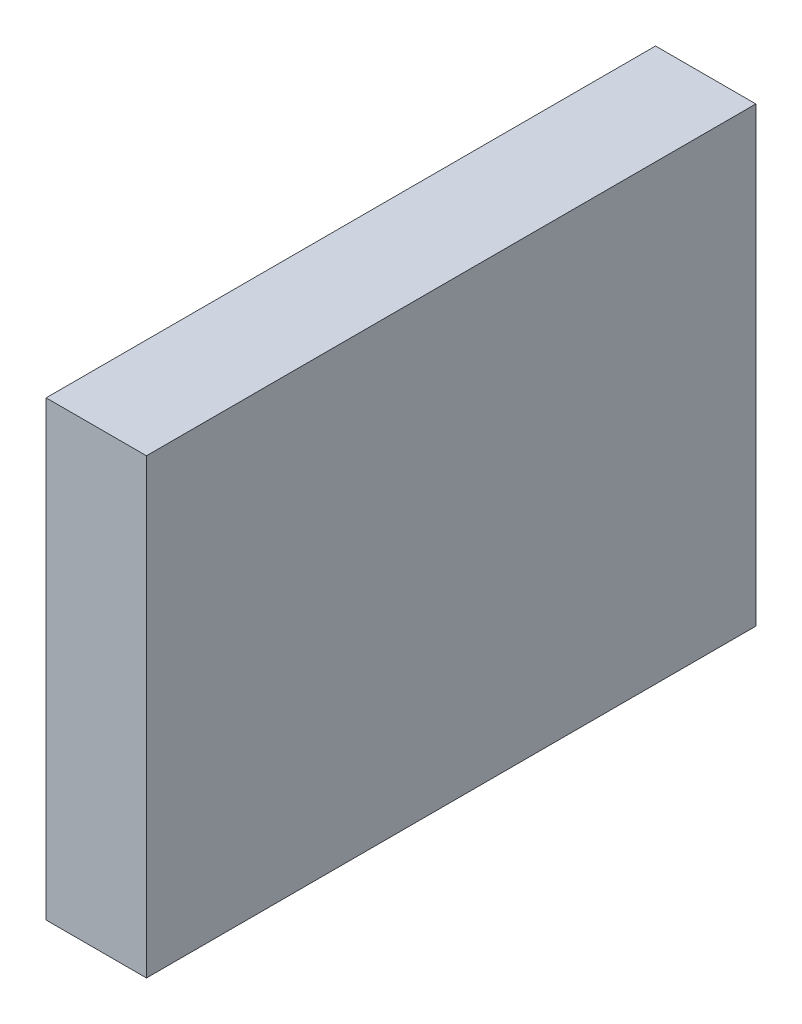
ISO-10303-21;
HEADER;
FILE_DESCRIPTION(('STEP AP214'),'2;1');
FILE_NAME('part.step','',(''),(''),'','','');
FILE_SCHEMA(('AUTOMOTIVE_DESIGN { 1 0 10303 214 1 1 1 1 }'));
ENDSEC;
DATA;
#1=APPLICATION_CONTEXT('core data for automotive mechanical design processes');
#2=APPLICATION_PROTOCOL_DEFINITION('international standard','automotive_design',2000,#1);
#3=PRODUCT_CONTEXT('',#1,'mechanical');
#4=PRODUCT('Part','Part','',(#3));
#5=PRODUCT_RELATED_PRODUCT_CATEGORY('part','',(#4));
#6=PRODUCT_DEFINITION_FORMATION('','',#4);
#7=PRODUCT_DEFINITION_CONTEXT('part definition',#1,'design');
#8=PRODUCT_DEFINITION('design','',#6,#7);
#9=PRODUCT_DEFINITION_SHAPE('','',#8);
#10=(LENGTH_UNIT() NAMED_UNIT(*) SI_UNIT(.MILLI.,.METRE.));
#11=(NAMED_UNIT(*) PLANE_ANGLE_UNIT() SI_UNIT($,.RADIAN.));
#12=(NAMED_UNIT(*) SI_UNIT($,.STERADIAN.) SOLID_ANGLE_UNIT());
#13=UNCERTAINTY_MEASURE_WITH_UNIT(LENGTH_MEASURE(1.E-05),#10,'distance_accuracy_value','');
#14=(GEOMETRIC_REPRESENTATION_CONTEXT(3) GLOBAL_UNCERTAINTY_ASSIGNED_CONTEXT((#13)) GLOBAL_UNIT_ASSIGNED_CONTEXT((#10,
#11,#12)) REPRESENTATION_CONTEXT('',''));
#15=CARTESIAN_POINT('',(0.,0.,0.));
#16=DIRECTION('',(0.,0.,1.));
#17=DIRECTION('',(1.,0.,0.));
#18=AXIS2_PLACEMENT_3D('',#15,#16,#17);
#19=CARTESIAN_POINT('',(38.,127.264432037924,-45.4372221809965));
#20=DIRECTION('',(0.,0.,1.));
#21=DIRECTION('',(1.,0.,0.));
#22=AXIS2_PLACEMENT_3D('',#19,#20,#21);
#23=PLANE('',#22);
#24=DIRECTION('',(0.,1.,0.));
#25=VECTOR('',#24,1.);
#26=CARTESIAN_POINT('',(0.,127.264432037924,-45.4372221809965));
#27=LINE('',#26,#25);
#28=CARTESIAN_POINT('',(0.,-44.0298745913196,-45.4372221809965));
#29=VERTEX_POINT('',#28);
#30=CARTESIAN_POINT('',(0.,127.264432037924,-45.4372221809965));
#31=VERTEX_POINT('',#30);
#32=EDGE_CURVE('E96',#29,#31,#27,.T.);
#33=ORIENTED_EDGE('',*,*,#32,.T.);
#34=DIRECTION('',(-1.,0.,0.));
#35=VECTOR('',#34,1.);
#36=CARTESIAN_POINT('',(38.,127.264432037924,-45.4372221809965));
#37=LINE('',#36,#35);
#38=CARTESIAN_POINT('',(38.,127.264432037924,-45.4372221809965));
#39=VERTEX_POINT('',#38);
#40=EDGE_CURVE('E11',#39,#31,#37,.T.);
#41=ORIENTED_EDGE('',*,*,#40,.F.);
#42=DIRECTION('',(0.,1.,0.));
#43=VECTOR('',#42,1.);
#44=CARTESIAN_POINT('',(38.,127.264432037924,-45.4372221809965));
#45=LINE('',#44,#43);
#46=CARTESIAN_POINT('',(38.,-44.0298745913196,-45.4372221809965));
#47=VERTEX_POINT('',#46);
#48=EDGE_CURVE('E84',#47,#39,#45,.T.);
#49=ORIENTED_EDGE('',*,*,#48,.F.);
#50=DIRECTION('',(-1.,0.,0.));
#51=VECTOR('',#50,1.);
#52=CARTESIAN_POINT('',(38.,-44.0298745913196,-45.4372221809965));
#53=LINE('',#52,#51);
#54=EDGE_CURVE('E92',#47,#29,#53,.T.);
#55=ORIENTED_EDGE('',*,*,#54,.T.);
#56=EDGE_LOOP('',(#33,#41,#49,#55));
#57=FACE_BOUND('',#56,.T.);
#58=ADVANCED_FACE('F33',(#57),#23,.F.);
#59=CARTESIAN_POINT('',(38.,127.264432037924,185.367782526012));
#60=DIRECTION('',(0.,-1.,0.));
#61=DIRECTION('',(0.,0.,-1.));
#62=AXIS2_PLACEMENT_3D('',#59,#60,#61);
#63=PLANE('',#62);
#64=DIRECTION('',(0.,0.,1.));
#65=VECTOR('',#64,1.);
#66=CARTESIAN_POINT('',(0.,127.264432037924,185.367782526012));
#67=LINE('',#66,#65);
#68=CARTESIAN_POINT('',(0.,127.264432037924,185.367782526012));
#69=VERTEX_POINT('',#68);
#70=EDGE_CURVE('E88',#31,#69,#67,.T.);
#71=ORIENTED_EDGE('',*,*,#70,.T.);
#72=DIRECTION('',(-1.,0.,0.));
#73=VECTOR('',#72,1.);
#74=CARTESIAN_POINT('',(38.,127.264432037924,185.367782526012));
#75=LINE('',#74,#73);
#76=CARTESIAN_POINT('',(38.,127.264432037924,185.367782526012));
#77=VERTEX_POINT('',#76);
#78=EDGE_CURVE('E41',#77,#69,#75,.T.);
#79=ORIENTED_EDGE('',*,*,#78,.F.);
#80=DIRECTION('',(0.,0.,1.));
#81=VECTOR('',#80,1.);
#82=CARTESIAN_POINT('',(38.,127.264432037924,185.367782526012));
#83=LINE('',#82,#81);
#84=EDGE_CURVE('E79',#39,#77,#83,.T.);
#85=ORIENTED_EDGE('',*,*,#84,.F.);
#86=ORIENTED_EDGE('',*,*,#40,.T.);
#87=EDGE_LOOP('',(#71,#79,#85,#86));
#88=FACE_BOUND('',#87,.T.);
#89=ADVANCED_FACE('F87',(#88),#63,.F.);
#90=CARTESIAN_POINT('',(38.,127.264432037924,185.367782526012));
#91=DIRECTION('',(0.,0.,-1.));
#92=DIRECTION('',(-1.,0.,0.));
#93=AXIS2_PLACEMENT_3D('',#90,#91,#92);
#94=PLANE('',#93);
#95=DIRECTION('',(0.,-1.,0.));
#96=VECTOR('',#95,1.);
#97=CARTESIAN_POINT('',(0.,127.264432037924,185.367782526012));
#98=LINE('',#97,#96);
#99=CARTESIAN_POINT('',(0.,-44.0298745913196,185.367782526012));
#100=VERTEX_POINT('',#99);
#101=EDGE_CURVE('E66',#69,#100,#98,.T.);
#102=ORIENTED_EDGE('',*,*,#101,.T.);
#103=DIRECTION('',(-1.,0.,0.));
#104=VECTOR('',#103,1.);
#105=CARTESIAN_POINT('',(38.,-44.0298745913196,185.367782526012));
#106=LINE('',#105,#104);
#107=CARTESIAN_POINT('',(38.,-44.0298745913196,185.367782526012));
#108=VERTEX_POINT('',#107);
#109=EDGE_CURVE('E89',#108,#100,#106,.T.);
#110=ORIENTED_EDGE('',*,*,#109,.F.);
#111=DIRECTION('',(0.,-1.,0.));
#112=VECTOR('',#111,1.);
#113=CARTESIAN_POINT('',(38.,127.264432037924,185.367782526012));
#114=LINE('',#113,#112);
#115=EDGE_CURVE('E82',#77,#108,#114,.T.);
#116=ORIENTED_EDGE('',*,*,#115,.F.);
#117=ORIENTED_EDGE('',*,*,#78,.T.);
#118=EDGE_LOOP('',(#102,#110,#116,#117));
#119=FACE_BOUND('',#118,.T.);
#120=ADVANCED_FACE('F90',(#119),#94,.F.);
#121=CARTESIAN_POINT('',(38.,-44.0298745913196,185.367782526012));
#122=DIRECTION('',(0.,1.,0.));
#123=DIRECTION('',(0.,0.,1.));
#124=AXIS2_PLACEMENT_3D('',#121,#122,#123);
#125=PLANE('',#124);
#126=DIRECTION('',(0.,0.,-1.));
#127=VECTOR('',#126,1.);
#128=CARTESIAN_POINT('',(0.,-44.0298745913196,185.367782526012));
#129=LINE('',#128,#127);
#130=EDGE_CURVE('E72',#100,#29,#129,.T.);
#131=ORIENTED_EDGE('',*,*,#130,.T.);
#132=ORIENTED_EDGE('',*,*,#54,.F.);
#133=DIRECTION('',(0.,0.,-1.));
#134=VECTOR('',#133,1.);
#135=CARTESIAN_POINT('',(38.,-44.0298745913196,185.367782526012));
#136=LINE('',#135,#134);
#137=EDGE_CURVE('E49',#108,#47,#136,.T.);
#138=ORIENTED_EDGE('',*,*,#137,.F.);
#139=ORIENTED_EDGE('',*,*,#109,.T.);
#140=EDGE_LOOP('',(#131,#132,#138,#139));
#141=FACE_BOUND('',#140,.T.);
#142=ADVANCED_FACE('F103',(#141),#125,.F.);
#143=CARTESIAN_POINT('',(38.,0.,0.));
#144=DIRECTION('',(1.,0.,0.));
#145=DIRECTION('',(0.,0.,-1.));
#146=AXIS2_PLACEMENT_3D('',#143,#144,#145);
#147=PLANE('',#146);
#148=ORIENTED_EDGE('',*,*,#48,.T.);
#149=ORIENTED_EDGE('',*,*,#84,.T.);
#150=ORIENTED_EDGE('',*,*,#115,.T.);
#151=ORIENTED_EDGE('',*,*,#137,.T.);
#152=EDGE_LOOP('',(#148,#149,#150,#151));
#153=FACE_BOUND('',#152,.T.);
#154=ADVANCED_FACE('F80',(#153),#147,.T.);
#155=CARTESIAN_POINT('',(0.,0.,0.));
#156=DIRECTION('',(1.,0.,0.));
#157=DIRECTION('',(0.,0.,-1.));
#158=AXIS2_PLACEMENT_3D('',#155,#156,#157);
#159=PLANE('',#158);
#160=ORIENTED_EDGE('',*,*,#32,.F.);
#161=ORIENTED_EDGE('',*,*,#130,.F.);
#162=ORIENTED_EDGE('',*,*,#101,.F.);
#163=ORIENTED_EDGE('',*,*,#70,.F.);
#164=EDGE_LOOP('',(#160,#161,#162,#163));
#165=FACE_BOUND('',#164,.T.);
#166=ADVANCED_FACE('F106',(#165),#159,.F.);
#167=CLOSED_SHELL('',(#58,#89,#120,#142,#154,#166));
#168=MANIFOLD_SOLID_BREP('B2',#167);
#169=ADVANCED_BREP_SHAPE_REPRESENTATION('',(#18,#168),#14);
#170=SHAPE_DEFINITION_REPRESENTATION(#9,#169);
ENDSEC;
END-ISO-10303-21;
